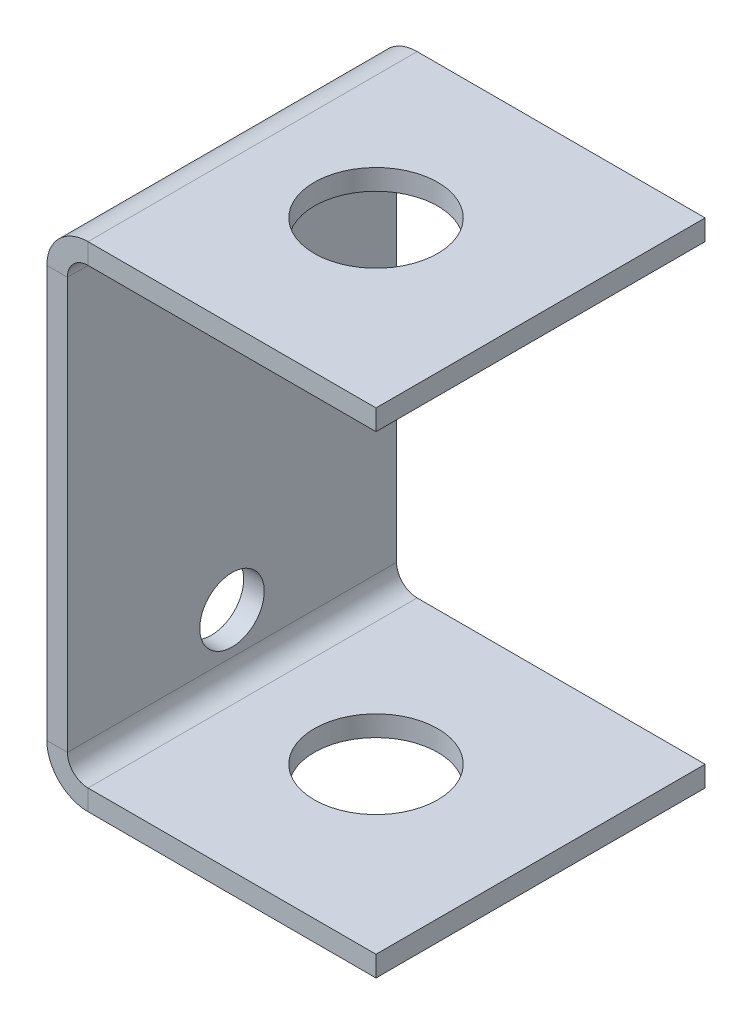
ISO-10303-21;
HEADER;
FILE_DESCRIPTION(('STEP AP214'),'2;1');
FILE_NAME('part.step','',(''),(''),'','','');
FILE_SCHEMA(('AUTOMOTIVE_DESIGN { 1 0 10303 214 1 1 1 1 }'));
ENDSEC;
DATA;
#1=APPLICATION_CONTEXT('core data for automotive mechanical design processes');
#2=APPLICATION_PROTOCOL_DEFINITION('international standard','automotive_design',2000,#1);
#3=PRODUCT_CONTEXT('',#1,'mechanical');
#4=PRODUCT('Part','Part','',(#3));
#5=PRODUCT_RELATED_PRODUCT_CATEGORY('part','',(#4));
#6=PRODUCT_DEFINITION_FORMATION('','',#4);
#7=PRODUCT_DEFINITION_CONTEXT('part definition',#1,'design');
#8=PRODUCT_DEFINITION('design','',#6,#7);
#9=PRODUCT_DEFINITION_SHAPE('','',#8);
#10=(LENGTH_UNIT() NAMED_UNIT(*) SI_UNIT(.MILLI.,.METRE.));
#11=(NAMED_UNIT(*) PLANE_ANGLE_UNIT() SI_UNIT($,.RADIAN.));
#12=(NAMED_UNIT(*) SI_UNIT($,.STERADIAN.) SOLID_ANGLE_UNIT());
#13=UNCERTAINTY_MEASURE_WITH_UNIT(LENGTH_MEASURE(1.E-05),#10,'distance_accuracy_value','');
#14=(GEOMETRIC_REPRESENTATION_CONTEXT(3) GLOBAL_UNCERTAINTY_ASSIGNED_CONTEXT((#13)) GLOBAL_UNIT_ASSIGNED_CONTEXT((#10,
#11,#12)) REPRESENTATION_CONTEXT('',''));
#15=CARTESIAN_POINT('',(0.,0.,0.));
#16=DIRECTION('',(0.,0.,1.));
#17=DIRECTION('',(1.,0.,0.));
#18=AXIS2_PLACEMENT_3D('',#15,#16,#17);
#19=CARTESIAN_POINT('',(15.875,627.3430863957,0.));
#20=DIRECTION('',(0.,0.,-1.));
#21=DIRECTION('',(-1.,0.,0.));
#22=AXIS2_PLACEMENT_3D('',#19,#20,#21);
#23=PLANE('',#22);
#24=DIRECTION('',(-1.,0.,0.));
#25=VECTOR('',#24,1.);
#26=CARTESIAN_POINT('',(12.7,627.3430863957,0.));
#27=LINE('',#26,#25);
#28=CARTESIAN_POINT('',(14.2875,627.3430863957,0.));
#29=VERTEX_POINT('',#28);
#30=CARTESIAN_POINT('',(12.7,627.3430863957,0.));
#31=VERTEX_POINT('',#30);
#32=EDGE_CURVE('E11',#29,#31,#27,.T.);
#33=ORIENTED_EDGE('',*,*,#32,.F.);
#34=CARTESIAN_POINT('',(15.875,627.3430863957,0.));
#35=DIRECTION('',(0.,0.,1.));
#36=DIRECTION('',(1.,0.,0.));
#37=AXIS2_PLACEMENT_3D('',#34,#35,#36);
#38=CIRCLE('',#37,1.58749999999997);
#39=CARTESIAN_POINT('',(15.875,628.9305863957,0.));
#40=VERTEX_POINT('',#39);
#41=EDGE_CURVE('E104',#40,#29,#38,.T.);
#42=ORIENTED_EDGE('',*,*,#41,.F.);
#43=DIRECTION('',(0.,1.,0.));
#44=VECTOR('',#43,1.);
#45=CARTESIAN_POINT('',(15.875,630.5180863957,0.));
#46=LINE('',#45,#44);
#47=CARTESIAN_POINT('',(15.875,630.5180863957,0.));
#48=VERTEX_POINT('',#47);
#49=EDGE_CURVE('E51',#40,#48,#46,.T.);
#50=ORIENTED_EDGE('',*,*,#49,.T.);
#51=CARTESIAN_POINT('',(15.875,627.3430863957,0.));
#52=DIRECTION('',(0.,0.,1.));
#53=DIRECTION('',(1.,0.,0.));
#54=AXIS2_PLACEMENT_3D('',#51,#52,#53);
#55=CIRCLE('',#54,3.17499999999997);
#56=EDGE_CURVE('E107',#48,#31,#55,.T.);
#57=ORIENTED_EDGE('',*,*,#56,.T.);
#58=EDGE_LOOP('',(#33,#42,#50,#57));
#59=FACE_BOUND('',#58,.T.);
#60=ADVANCED_FACE('F41',(#59),#23,.F.);
#61=CARTESIAN_POINT('',(15.875,630.5180863957,0.));
#62=DIRECTION('',(0.,0.,-1.));
#63=DIRECTION('',(-1.,0.,0.));
#64=AXIS2_PLACEMENT_3D('',#61,#62,#63);
#65=PLANE('',#64);
#66=ORIENTED_EDGE('',*,*,#49,.F.);
#67=DIRECTION('',(1.,0.,0.));
#68=VECTOR('',#67,1.);
#69=CARTESIAN_POINT('',(15.875,628.9305863957,0.));
#70=LINE('',#69,#68);
#71=CARTESIAN_POINT('',(38.0999999999999,628.9305863957,0.));
#72=VERTEX_POINT('',#71);
#73=EDGE_CURVE('E218',#72,#40,#70,.F.);
#74=ORIENTED_EDGE('',*,*,#73,.F.);
#75=DIRECTION('',(0.,1.,0.));
#76=VECTOR('',#75,1.);
#77=CARTESIAN_POINT('',(38.0999999999999,630.5180863957,0.));
#78=LINE('',#77,#76);
#79=CARTESIAN_POINT('',(38.0999999999999,630.5180863957,0.));
#80=VERTEX_POINT('',#79);
#81=EDGE_CURVE('E171',#72,#80,#78,.T.);
#82=ORIENTED_EDGE('',*,*,#81,.T.);
#83=DIRECTION('',(-1.,0.,0.));
#84=VECTOR('',#83,1.);
#85=CARTESIAN_POINT('',(15.875,630.5180863957,0.));
#86=LINE('',#85,#84);
#87=EDGE_CURVE('E211',#80,#48,#86,.T.);
#88=ORIENTED_EDGE('',*,*,#87,.T.);
#89=EDGE_LOOP('',(#66,#74,#82,#88));
#90=FACE_BOUND('',#89,.T.);
#91=ADVANCED_FACE('F329',(#90),#65,.F.);
#92=CARTESIAN_POINT('',(38.0999999999999,630.5180863957,-25.4));
#93=DIRECTION('',(-1.,0.,0.));
#94=DIRECTION('',(0.,0.,1.));
#95=AXIS2_PLACEMENT_3D('',#92,#93,#94);
#96=PLANE('',#95);
#97=ORIENTED_EDGE('',*,*,#81,.F.);
#98=DIRECTION('',(0.,0.,1.));
#99=VECTOR('',#98,1.);
#100=CARTESIAN_POINT('',(38.0999999999999,628.9305863957,-25.4));
#101=LINE('',#100,#99);
#102=CARTESIAN_POINT('',(38.0999999999999,628.9305863957,-25.4));
#103=VERTEX_POINT('',#102);
#104=EDGE_CURVE('E216',#103,#72,#101,.T.);
#105=ORIENTED_EDGE('',*,*,#104,.F.);
#106=DIRECTION('',(0.,1.,0.));
#107=VECTOR('',#106,1.);
#108=CARTESIAN_POINT('',(38.0999999999999,630.5180863957,-25.4));
#109=LINE('',#108,#107);
#110=CARTESIAN_POINT('',(38.0999999999999,630.5180863957,-25.4));
#111=VERTEX_POINT('',#110);
#112=EDGE_CURVE('E168',#103,#111,#109,.T.);
#113=ORIENTED_EDGE('',*,*,#112,.T.);
#114=DIRECTION('',(0.,0.,1.));
#115=VECTOR('',#114,1.);
#116=CARTESIAN_POINT('',(38.0999999999999,630.5180863957,-25.4));
#117=LINE('',#116,#115);
#118=EDGE_CURVE('E234',#111,#80,#117,.T.);
#119=ORIENTED_EDGE('',*,*,#118,.T.);
#120=EDGE_LOOP('',(#97,#105,#113,#119));
#121=FACE_BOUND('',#120,.T.);
#122=ADVANCED_FACE('F335',(#121),#96,.F.);
#123=CARTESIAN_POINT('',(15.875,630.5180863957,-25.4));
#124=DIRECTION('',(0.,0.,-1.));
#125=DIRECTION('',(-1.,0.,0.));
#126=AXIS2_PLACEMENT_3D('',#123,#124,#125);
#127=PLANE('',#126);
#128=ORIENTED_EDGE('',*,*,#112,.F.);
#129=DIRECTION('',(1.,0.,0.));
#130=VECTOR('',#129,1.);
#131=CARTESIAN_POINT('',(15.875,628.9305863957,-25.4));
#132=LINE('',#131,#130);
#133=CARTESIAN_POINT('',(15.875,628.9305863957,-25.4));
#134=VERTEX_POINT('',#133);
#135=EDGE_CURVE('E198',#103,#134,#132,.F.);
#136=ORIENTED_EDGE('',*,*,#135,.T.);
#137=DIRECTION('',(0.,1.,0.));
#138=VECTOR('',#137,1.);
#139=CARTESIAN_POINT('',(15.875,630.5180863957,-25.4));
#140=LINE('',#139,#138);
#141=CARTESIAN_POINT('',(15.875,630.5180863957,-25.4));
#142=VERTEX_POINT('',#141);
#143=EDGE_CURVE('E165',#134,#142,#140,.T.);
#144=ORIENTED_EDGE('',*,*,#143,.T.);
#145=DIRECTION('',(-1.,0.,0.));
#146=VECTOR('',#145,1.);
#147=CARTESIAN_POINT('',(15.875,630.5180863957,-25.4));
#148=LINE('',#147,#146);
#149=EDGE_CURVE('E237',#111,#142,#148,.T.);
#150=ORIENTED_EDGE('',*,*,#149,.F.);
#151=EDGE_LOOP('',(#128,#136,#144,#150));
#152=FACE_BOUND('',#151,.T.);
#153=ADVANCED_FACE('F506',(#152),#127,.T.);
#154=CARTESIAN_POINT('',(15.875,627.3430863957,-25.4));
#155=DIRECTION('',(0.,0.,-1.));
#156=DIRECTION('',(-1.,0.,0.));
#157=AXIS2_PLACEMENT_3D('',#154,#155,#156);
#158=PLANE('',#157);
#159=ORIENTED_EDGE('',*,*,#143,.F.);
#160=CARTESIAN_POINT('',(15.875,627.3430863957,-25.4));
#161=DIRECTION('',(0.,0.,1.));
#162=DIRECTION('',(1.,0.,0.));
#163=AXIS2_PLACEMENT_3D('',#160,#161,#162);
#164=CIRCLE('',#163,1.58749999999997);
#165=CARTESIAN_POINT('',(14.2875,627.3430863957,-25.4));
#166=VERTEX_POINT('',#165);
#167=EDGE_CURVE('E133',#134,#166,#164,.T.);
#168=ORIENTED_EDGE('',*,*,#167,.T.);
#169=DIRECTION('',(-1.,0.,0.));
#170=VECTOR('',#169,1.);
#171=CARTESIAN_POINT('',(12.7,627.3430863957,-25.4));
#172=LINE('',#171,#170);
#173=CARTESIAN_POINT('',(12.7,627.3430863957,-25.4));
#174=VERTEX_POINT('',#173);
#175=EDGE_CURVE('E162',#166,#174,#172,.T.);
#176=ORIENTED_EDGE('',*,*,#175,.T.);
#177=CARTESIAN_POINT('',(15.875,627.3430863957,-25.4));
#178=DIRECTION('',(0.,0.,1.));
#179=DIRECTION('',(1.,0.,0.));
#180=AXIS2_PLACEMENT_3D('',#177,#178,#179);
#181=CIRCLE('',#180,3.17499999999997);
#182=EDGE_CURVE('E260',#142,#174,#181,.T.);
#183=ORIENTED_EDGE('',*,*,#182,.F.);
#184=EDGE_LOOP('',(#159,#168,#176,#183));
#185=FACE_BOUND('',#184,.T.);
#186=ADVANCED_FACE('F296',(#185),#158,.T.);
#187=CARTESIAN_POINT('',(12.7,595.5930863957,-25.4));
#188=DIRECTION('',(0.,0.,-1.));
#189=DIRECTION('',(0.,-1.,0.));
#190=AXIS2_PLACEMENT_3D('',#187,#188,#189);
#191=PLANE('',#190);
#192=ORIENTED_EDGE('',*,*,#175,.F.);
#193=DIRECTION('',(0.,-1.,0.));
#194=VECTOR('',#193,1.);
#195=CARTESIAN_POINT('',(14.2875,595.5930863957,-25.4));
#196=LINE('',#195,#194);
#197=CARTESIAN_POINT('',(14.2875,595.5930863957,-25.4));
#198=VERTEX_POINT('',#197);
#199=EDGE_CURVE('E123',#166,#198,#196,.T.);
#200=ORIENTED_EDGE('',*,*,#199,.T.);
#201=DIRECTION('',(-1.,0.,0.));
#202=VECTOR('',#201,1.);
#203=CARTESIAN_POINT('',(12.7,595.5930863957,-25.4));
#204=LINE('',#203,#202);
#205=CARTESIAN_POINT('',(12.7,595.5930863957,-25.4));
#206=VERTEX_POINT('',#205);
#207=EDGE_CURVE('E159',#198,#206,#204,.T.);
#208=ORIENTED_EDGE('',*,*,#207,.T.);
#209=DIRECTION('',(0.,-1.,0.));
#210=VECTOR('',#209,1.);
#211=CARTESIAN_POINT('',(12.7,595.5930863957,-25.4));
#212=LINE('',#211,#210);
#213=EDGE_CURVE('E253',#174,#206,#212,.T.);
#214=ORIENTED_EDGE('',*,*,#213,.F.);
#215=EDGE_LOOP('',(#192,#200,#208,#214));
#216=FACE_BOUND('',#215,.T.);
#217=ADVANCED_FACE('F289',(#216),#191,.T.);
#218=CARTESIAN_POINT('',(15.875,595.5930863957,-25.4));
#219=DIRECTION('',(0.,0.,-1.));
#220=DIRECTION('',(-1.,0.,0.));
#221=AXIS2_PLACEMENT_3D('',#218,#219,#220);
#222=PLANE('',#221);
#223=ORIENTED_EDGE('',*,*,#207,.F.);
#224=CARTESIAN_POINT('',(15.875,595.5930863957,-25.4));
#225=DIRECTION('',(0.,0.,1.));
#226=DIRECTION('',(1.,0.,0.));
#227=AXIS2_PLACEMENT_3D('',#224,#225,#226);
#228=CIRCLE('',#227,1.58750000000003);
#229=CARTESIAN_POINT('',(15.875,594.0055863957,-25.4));
#230=VERTEX_POINT('',#229);
#231=EDGE_CURVE('E202',#198,#230,#228,.T.);
#232=ORIENTED_EDGE('',*,*,#231,.T.);
#233=DIRECTION('',(0.,-1.,0.));
#234=VECTOR('',#233,1.);
#235=CARTESIAN_POINT('',(15.875,592.4180863957,-25.4));
#236=LINE('',#235,#234);
#237=CARTESIAN_POINT('',(15.875,592.4180863957,-25.4));
#238=VERTEX_POINT('',#237);
#239=EDGE_CURVE('E156',#230,#238,#236,.T.);
#240=ORIENTED_EDGE('',*,*,#239,.T.);
#241=CARTESIAN_POINT('',(15.875,595.5930863957,-25.4));
#242=DIRECTION('',(0.,0.,1.));
#243=DIRECTION('',(1.,0.,0.));
#244=AXIS2_PLACEMENT_3D('',#241,#242,#243);
#245=CIRCLE('',#244,3.17500000000003);
#246=EDGE_CURVE('E174',#206,#238,#245,.T.);
#247=ORIENTED_EDGE('',*,*,#246,.F.);
#248=EDGE_LOOP('',(#223,#232,#240,#247));
#249=FACE_BOUND('',#248,.T.);
#250=ADVANCED_FACE('F316',(#249),#222,.T.);
#251=CARTESIAN_POINT('',(38.0999999999999,592.4180863957,-25.4));
#252=DIRECTION('',(0.,0.,-1.));
#253=DIRECTION('',(1.,0.,0.));
#254=AXIS2_PLACEMENT_3D('',#251,#252,#253);
#255=PLANE('',#254);
#256=ORIENTED_EDGE('',*,*,#239,.F.);
#257=DIRECTION('',(1.,0.,0.));
#258=VECTOR('',#257,1.);
#259=CARTESIAN_POINT('',(38.0999999999999,594.0055863957,-25.4));
#260=LINE('',#259,#258);
#261=CARTESIAN_POINT('',(38.0999999999999,594.0055863957,-25.4));
#262=VERTEX_POINT('',#261);
#263=EDGE_CURVE('E194',#230,#262,#260,.T.);
#264=ORIENTED_EDGE('',*,*,#263,.T.);
#265=DIRECTION('',(0.,-1.,0.));
#266=VECTOR('',#265,1.);
#267=CARTESIAN_POINT('',(38.0999999999999,592.4180863957,-25.4));
#268=LINE('',#267,#266);
#269=CARTESIAN_POINT('',(38.0999999999999,592.4180863957,-25.4));
#270=VERTEX_POINT('',#269);
#271=EDGE_CURVE('E154',#262,#270,#268,.T.);
#272=ORIENTED_EDGE('',*,*,#271,.T.);
#273=DIRECTION('',(1.,0.,0.));
#274=VECTOR('',#273,1.);
#275=CARTESIAN_POINT('',(38.0999999999999,592.4180863957,-25.4));
#276=LINE('',#275,#274);
#277=EDGE_CURVE('E268',#238,#270,#276,.T.);
#278=ORIENTED_EDGE('',*,*,#277,.F.);
#279=EDGE_LOOP('',(#256,#264,#272,#278));
#280=FACE_BOUND('',#279,.T.);
#281=ADVANCED_FACE('F318',(#280),#255,.T.);
#282=CARTESIAN_POINT('',(38.0999999999999,592.4180863957,-25.4));
#283=DIRECTION('',(1.,0.,0.));
#284=DIRECTION('',(0.,0.,1.));
#285=AXIS2_PLACEMENT_3D('',#282,#283,#284);
#286=PLANE('',#285);
#287=ORIENTED_EDGE('',*,*,#271,.F.);
#288=DIRECTION('',(0.,0.,-1.));
#289=VECTOR('',#288,1.);
#290=CARTESIAN_POINT('',(38.0999999999999,594.0055863957,-25.4));
#291=LINE('',#290,#289);
#292=CARTESIAN_POINT('',(38.0999999999999,594.0055863957,0.));
#293=VERTEX_POINT('',#292);
#294=EDGE_CURVE('E203',#262,#293,#291,.F.);
#295=ORIENTED_EDGE('',*,*,#294,.T.);
#296=DIRECTION('',(0.,-1.,0.));
#297=VECTOR('',#296,1.);
#298=CARTESIAN_POINT('',(38.0999999999999,592.4180863957,0.));
#299=LINE('',#298,#297);
#300=CARTESIAN_POINT('',(38.0999999999999,592.4180863957,0.));
#301=VERTEX_POINT('',#300);
#302=EDGE_CURVE('E60',#293,#301,#299,.T.);
#303=ORIENTED_EDGE('',*,*,#302,.T.);
#304=DIRECTION('',(0.,0.,1.));
#305=VECTOR('',#304,1.);
#306=CARTESIAN_POINT('',(38.0999999999999,592.4180863957,-25.4));
#307=LINE('',#306,#305);
#308=EDGE_CURVE('E187',#270,#301,#307,.T.);
#309=ORIENTED_EDGE('',*,*,#308,.F.);
#310=EDGE_LOOP('',(#287,#295,#303,#309));
#311=FACE_BOUND('',#310,.T.);
#312=ADVANCED_FACE('F319',(#311),#286,.T.);
#313=CARTESIAN_POINT('',(38.0999999999999,592.4180863957,0.));
#314=DIRECTION('',(0.,0.,-1.));
#315=DIRECTION('',(1.,0.,0.));
#316=AXIS2_PLACEMENT_3D('',#313,#314,#315);
#317=PLANE('',#316);
#318=ORIENTED_EDGE('',*,*,#302,.F.);
#319=DIRECTION('',(1.,0.,0.));
#320=VECTOR('',#319,1.);
#321=CARTESIAN_POINT('',(38.0999999999999,594.0055863957,0.));
#322=LINE('',#321,#320);
#323=CARTESIAN_POINT('',(15.875,594.0055863957,0.));
#324=VERTEX_POINT('',#323);
#325=EDGE_CURVE('E195',#324,#293,#322,.T.);
#326=ORIENTED_EDGE('',*,*,#325,.F.);
#327=DIRECTION('',(0.,-1.,0.));
#328=VECTOR('',#327,1.);
#329=CARTESIAN_POINT('',(15.875,592.4180863957,0.));
#330=LINE('',#329,#328);
#331=CARTESIAN_POINT('',(15.875,592.4180863957,0.));
#332=VERTEX_POINT('',#331);
#333=EDGE_CURVE('E150',#324,#332,#330,.T.);
#334=ORIENTED_EDGE('',*,*,#333,.T.);
#335=DIRECTION('',(1.,0.,0.));
#336=VECTOR('',#335,1.);
#337=CARTESIAN_POINT('',(38.0999999999999,592.4180863957,0.));
#338=LINE('',#337,#336);
#339=EDGE_CURVE('E263',#332,#301,#338,.T.);
#340=ORIENTED_EDGE('',*,*,#339,.T.);
#341=EDGE_LOOP('',(#318,#326,#334,#340));
#342=FACE_BOUND('',#341,.T.);
#343=ADVANCED_FACE('F276',(#342),#317,.F.);
#344=CARTESIAN_POINT('',(15.875,595.5930863957,0.));
#345=DIRECTION('',(0.,0.,-1.));
#346=DIRECTION('',(-1.,0.,0.));
#347=AXIS2_PLACEMENT_3D('',#344,#345,#346);
#348=PLANE('',#347);
#349=ORIENTED_EDGE('',*,*,#333,.F.);
#350=CARTESIAN_POINT('',(15.875,595.5930863957,0.));
#351=DIRECTION('',(0.,0.,1.));
#352=DIRECTION('',(1.,0.,0.));
#353=AXIS2_PLACEMENT_3D('',#350,#351,#352);
#354=CIRCLE('',#353,1.58750000000003);
#355=CARTESIAN_POINT('',(14.2875,595.5930863957,0.));
#356=VERTEX_POINT('',#355);
#357=EDGE_CURVE('E199',#356,#324,#354,.T.);
#358=ORIENTED_EDGE('',*,*,#357,.F.);
#359=DIRECTION('',(-1.,0.,0.));
#360=VECTOR('',#359,1.);
#361=CARTESIAN_POINT('',(12.7,595.5930863957,0.));
#362=LINE('',#361,#360);
#363=CARTESIAN_POINT('',(12.7,595.5930863957,0.));
#364=VERTEX_POINT('',#363);
#365=EDGE_CURVE('E139',#356,#364,#362,.T.);
#366=ORIENTED_EDGE('',*,*,#365,.T.);
#367=CARTESIAN_POINT('',(15.875,595.5930863957,0.));
#368=DIRECTION('',(0.,0.,1.));
#369=DIRECTION('',(1.,0.,0.));
#370=AXIS2_PLACEMENT_3D('',#367,#368,#369);
#371=CIRCLE('',#370,3.17500000000003);
#372=EDGE_CURVE('E180',#364,#332,#371,.T.);
#373=ORIENTED_EDGE('',*,*,#372,.T.);
#374=EDGE_LOOP('',(#349,#358,#366,#373));
#375=FACE_BOUND('',#374,.T.);
#376=ADVANCED_FACE('F279',(#375),#348,.F.);
#377=CARTESIAN_POINT('',(12.6999999999996,624.1680863957,-12.7));
#378=DIRECTION('',(-1.,0.,0.));
#379=DIRECTION('',(0.,-1.,0.));
#380=AXIS2_PLACEMENT_3D('',#377,#378,#379);
#381=CYLINDRICAL_SURFACE('',#380,2.48919999999993);
#382=CARTESIAN_POINT('',(12.6999999999996,624.1680863957,-12.7));
#383=DIRECTION('',(-1.,0.,0.));
#384=DIRECTION('',(0.,-1.,0.));
#385=AXIS2_PLACEMENT_3D('',#382,#383,#384);
#386=CIRCLE('',#385,2.48919999999993);
#387=CARTESIAN_POINT('',(12.6999999999996,621.6788863957,-12.7));
#388=VERTEX_POINT('',#387);
#389=EDGE_CURVE('E243',#388,#388,#386,.T.);
#390=ORIENTED_EDGE('',*,*,#389,.T.);
#391=EDGE_LOOP('',(#390));
#392=FACE_BOUND('',#391,.T.);
#393=CARTESIAN_POINT('',(14.2874999999996,624.1680863957,-12.7));
#394=DIRECTION('',(-1.,0.,0.));
#395=DIRECTION('',(0.,-1.,0.));
#396=AXIS2_PLACEMENT_3D('',#393,#394,#395);
#397=CIRCLE('',#396,2.48919999999993);
#398=CARTESIAN_POINT('',(14.2874999999996,621.6788863957,-12.7));
#399=VERTEX_POINT('',#398);
#400=EDGE_CURVE('E144',#399,#399,#397,.T.);
#401=ORIENTED_EDGE('',*,*,#400,.F.);
#402=EDGE_LOOP('',(#401));
#403=FACE_BOUND('',#402,.T.);
#404=ADVANCED_FACE('F342',(#392,#403),#381,.F.);
#405=CARTESIAN_POINT('',(12.6999999999996,598.7680863957,-12.7));
#406=DIRECTION('',(-1.,0.,0.));
#407=DIRECTION('',(0.,-1.,0.));
#408=AXIS2_PLACEMENT_3D('',#405,#406,#407);
#409=CYLINDRICAL_SURFACE('',#408,2.48919999999993);
#410=CARTESIAN_POINT('',(12.6999999999996,598.7680863957,-12.7));
#411=DIRECTION('',(-1.,0.,0.));
#412=DIRECTION('',(0.,-1.,0.));
#413=AXIS2_PLACEMENT_3D('',#410,#411,#412);
#414=CIRCLE('',#413,2.48919999999993);
#415=CARTESIAN_POINT('',(12.6999999999996,596.2788863957,-12.7));
#416=VERTEX_POINT('',#415);
#417=EDGE_CURVE('E246',#416,#416,#414,.T.);
#418=ORIENTED_EDGE('',*,*,#417,.T.);
#419=EDGE_LOOP('',(#418));
#420=FACE_BOUND('',#419,.T.);
#421=CARTESIAN_POINT('',(14.2874999999996,598.7680863957,-12.7));
#422=DIRECTION('',(-1.,0.,0.));
#423=DIRECTION('',(0.,-1.,0.));
#424=AXIS2_PLACEMENT_3D('',#421,#422,#423);
#425=CIRCLE('',#424,2.48919999999993);
#426=CARTESIAN_POINT('',(14.2874999999996,596.2788863957,-12.7));
#427=VERTEX_POINT('',#426);
#428=EDGE_CURVE('E141',#427,#427,#425,.T.);
#429=ORIENTED_EDGE('',*,*,#428,.F.);
#430=EDGE_LOOP('',(#429));
#431=FACE_BOUND('',#430,.T.);
#432=ADVANCED_FACE('F43',(#420,#431),#409,.F.);
#433=CARTESIAN_POINT('',(12.7,595.5930863957,0.));
#434=DIRECTION('',(0.,0.,-1.));
#435=DIRECTION('',(0.,-1.,0.));
#436=AXIS2_PLACEMENT_3D('',#433,#434,#435);
#437=PLANE('',#436);
#438=DIRECTION('',(0.,-1.,0.));
#439=VECTOR('',#438,1.);
#440=CARTESIAN_POINT('',(14.2875,595.5930863957,0.));
#441=LINE('',#440,#439);
#442=EDGE_CURVE('E120',#29,#356,#441,.T.);
#443=ORIENTED_EDGE('',*,*,#442,.F.);
#444=ORIENTED_EDGE('',*,*,#32,.T.);
#445=DIRECTION('',(0.,-1.,0.));
#446=VECTOR('',#445,1.);
#447=CARTESIAN_POINT('',(12.7,595.5930863957,0.));
#448=LINE('',#447,#446);
#449=EDGE_CURVE('E249',#31,#364,#448,.T.);
#450=ORIENTED_EDGE('',*,*,#449,.T.);
#451=ORIENTED_EDGE('',*,*,#365,.F.);
#452=EDGE_LOOP('',(#443,#444,#450,#451));
#453=FACE_BOUND('',#452,.T.);
#454=ADVANCED_FACE('F137',(#453),#437,.F.);
#455=CARTESIAN_POINT('',(15.875,595.5930863957,-25.4));
#456=DIRECTION('',(0.,0.,1.));
#457=DIRECTION('',(1.,0.,0.));
#458=AXIS2_PLACEMENT_3D('',#455,#456,#457);
#459=CYLINDRICAL_SURFACE('',#458,3.17500000000003);
#460=ORIENTED_EDGE('',*,*,#372,.F.);
#461=DIRECTION('',(0.,0.,1.));
#462=VECTOR('',#461,1.);
#463=CARTESIAN_POINT('',(12.7,595.5930863957,-25.4));
#464=LINE('',#463,#462);
#465=EDGE_CURVE('E256',#206,#364,#464,.T.);
#466=ORIENTED_EDGE('',*,*,#465,.F.);
#467=ORIENTED_EDGE('',*,*,#246,.T.);
#468=DIRECTION('',(0.,0.,1.));
#469=VECTOR('',#468,1.);
#470=CARTESIAN_POINT('',(15.875,592.4180863957,-25.4));
#471=LINE('',#470,#469);
#472=EDGE_CURVE('E266',#238,#332,#471,.T.);
#473=ORIENTED_EDGE('',*,*,#472,.T.);
#474=EDGE_LOOP('',(#460,#466,#467,#473));
#475=FACE_BOUND('',#474,.T.);
#476=ADVANCED_FACE('F341',(#475),#459,.T.);
#477=CARTESIAN_POINT('',(38.0999999999999,592.4180863957,-25.4));
#478=DIRECTION('',(0.,-1.,0.));
#479=DIRECTION('',(0.,0.,-1.));
#480=AXIS2_PLACEMENT_3D('',#477,#478,#479);
#481=PLANE('',#480);
#482=CARTESIAN_POINT('',(25.3999999999999,592.4180863957,-12.7));
#483=DIRECTION('',(0.,1.,0.));
#484=DIRECTION('',(0.,0.,1.));
#485=AXIS2_PLACEMENT_3D('',#482,#483,#484);
#486=CIRCLE('',#485,4.7625);
#487=CARTESIAN_POINT('',(25.3999999999999,592.4180863957,-7.9375));
#488=VERTEX_POINT('',#487);
#489=EDGE_CURVE('E227',#488,#488,#486,.T.);
#490=ORIENTED_EDGE('',*,*,#489,.T.);
#491=EDGE_LOOP('',(#490));
#492=FACE_BOUND('',#491,.T.);
#493=ORIENTED_EDGE('',*,*,#339,.F.);
#494=ORIENTED_EDGE('',*,*,#472,.F.);
#495=ORIENTED_EDGE('',*,*,#277,.T.);
#496=ORIENTED_EDGE('',*,*,#308,.T.);
#497=EDGE_LOOP('',(#493,#494,#495,#496));
#498=FACE_BOUND('',#497,.T.);
#499=ADVANCED_FACE('F272',(#492,#498),#481,.T.);
#500=CARTESIAN_POINT('',(15.875,627.3430863957,-25.4));
#501=DIRECTION('',(0.,0.,1.));
#502=DIRECTION('',(1.,0.,0.));
#503=AXIS2_PLACEMENT_3D('',#500,#501,#502);
#504=CYLINDRICAL_SURFACE('',#503,3.17499999999997);
#505=ORIENTED_EDGE('',*,*,#56,.F.);
#506=DIRECTION('',(0.,0.,1.));
#507=VECTOR('',#506,1.);
#508=CARTESIAN_POINT('',(15.875,630.5180863957,-25.4));
#509=LINE('',#508,#507);
#510=EDGE_CURVE('E240',#142,#48,#509,.T.);
#511=ORIENTED_EDGE('',*,*,#510,.F.);
#512=ORIENTED_EDGE('',*,*,#182,.T.);
#513=DIRECTION('',(0.,0.,1.));
#514=VECTOR('',#513,1.);
#515=CARTESIAN_POINT('',(12.7,627.3430863957,-25.4));
#516=LINE('',#515,#514);
#517=EDGE_CURVE('E251',#174,#31,#516,.T.);
#518=ORIENTED_EDGE('',*,*,#517,.T.);
#519=EDGE_LOOP('',(#505,#511,#512,#518));
#520=FACE_BOUND('',#519,.T.);
#521=ADVANCED_FACE('F301',(#520),#504,.T.);
#522=CARTESIAN_POINT('',(12.7,595.5930863957,-25.4));
#523=DIRECTION('',(-1.,0.,0.));
#524=DIRECTION('',(0.,-1.,0.));
#525=AXIS2_PLACEMENT_3D('',#522,#523,#524);
#526=PLANE('',#525);
#527=ORIENTED_EDGE('',*,*,#389,.F.);
#528=EDGE_LOOP('',(#527));
#529=FACE_BOUND('',#528,.T.);
#530=ORIENTED_EDGE('',*,*,#417,.F.);
#531=EDGE_LOOP('',(#530));
#532=FACE_BOUND('',#531,.T.);
#533=ORIENTED_EDGE('',*,*,#449,.F.);
#534=ORIENTED_EDGE('',*,*,#517,.F.);
#535=ORIENTED_EDGE('',*,*,#213,.T.);
#536=ORIENTED_EDGE('',*,*,#465,.T.);
#537=EDGE_LOOP('',(#533,#534,#535,#536));
#538=FACE_BOUND('',#537,.T.);
#539=ADVANCED_FACE('F381',(#529,#532,#538),#526,.T.);
#540=CARTESIAN_POINT('',(15.875,630.5180863957,-25.4));
#541=DIRECTION('',(0.,1.,0.));
#542=DIRECTION('',(0.,0.,1.));
#543=AXIS2_PLACEMENT_3D('',#540,#541,#542);
#544=PLANE('',#543);
#545=CARTESIAN_POINT('',(25.3999999999999,630.5180863957,-12.7));
#546=DIRECTION('',(0.,1.,0.));
#547=DIRECTION('',(0.,0.,1.));
#548=AXIS2_PLACEMENT_3D('',#545,#546,#547);
#549=CIRCLE('',#548,4.7625);
#550=CARTESIAN_POINT('',(25.3999999999999,630.5180863957,-7.9375));
#551=VERTEX_POINT('',#550);
#552=EDGE_CURVE('E230',#551,#551,#549,.T.);
#553=ORIENTED_EDGE('',*,*,#552,.F.);
#554=EDGE_LOOP('',(#553));
#555=FACE_BOUND('',#554,.T.);
#556=ORIENTED_EDGE('',*,*,#87,.F.);
#557=ORIENTED_EDGE('',*,*,#118,.F.);
#558=ORIENTED_EDGE('',*,*,#149,.T.);
#559=ORIENTED_EDGE('',*,*,#510,.T.);
#560=EDGE_LOOP('',(#556,#557,#558,#559));
#561=FACE_BOUND('',#560,.T.);
#562=ADVANCED_FACE('F307',(#555,#561),#544,.T.);
#563=CARTESIAN_POINT('',(15.875,595.5930863957,-25.4));
#564=DIRECTION('',(0.,0.,1.));
#565=DIRECTION('',(1.,0.,0.));
#566=AXIS2_PLACEMENT_3D('',#563,#564,#565);
#567=CYLINDRICAL_SURFACE('',#566,1.58750000000003);
#568=ORIENTED_EDGE('',*,*,#357,.T.);
#569=DIRECTION('',(0.,0.,1.));
#570=VECTOR('',#569,1.);
#571=CARTESIAN_POINT('',(15.875,594.0055863957,-25.4));
#572=LINE('',#571,#570);
#573=EDGE_CURVE('E192',#230,#324,#572,.T.);
#574=ORIENTED_EDGE('',*,*,#573,.F.);
#575=ORIENTED_EDGE('',*,*,#231,.F.);
#576=DIRECTION('',(0.,0.,1.));
#577=VECTOR('',#576,1.);
#578=CARTESIAN_POINT('',(14.2875,595.5930863957,-25.4));
#579=LINE('',#578,#577);
#580=EDGE_CURVE('E134',#198,#356,#579,.T.);
#581=ORIENTED_EDGE('',*,*,#580,.T.);
#582=EDGE_LOOP('',(#568,#574,#575,#581));
#583=FACE_BOUND('',#582,.T.);
#584=ADVANCED_FACE('F287',(#583),#567,.F.);
#585=CARTESIAN_POINT('',(38.0999999999999,594.0055863957,-25.4));
#586=DIRECTION('',(0.,-1.,0.));
#587=DIRECTION('',(0.,0.,-1.));
#588=AXIS2_PLACEMENT_3D('',#585,#586,#587);
#589=PLANE('',#588);
#590=CARTESIAN_POINT('',(25.3999999999999,594.0055863957,-12.7));
#591=DIRECTION('',(0.,-1.,0.));
#592=DIRECTION('',(0.,0.,-1.));
#593=AXIS2_PLACEMENT_3D('',#590,#591,#592);
#594=CIRCLE('',#593,4.7625);
#595=CARTESIAN_POINT('',(25.3999999999999,594.0055863957,-17.4625));
#596=VERTEX_POINT('',#595);
#597=EDGE_CURVE('E219',#596,#596,#594,.T.);
#598=ORIENTED_EDGE('',*,*,#597,.T.);
#599=EDGE_LOOP('',(#598));
#600=FACE_BOUND('',#599,.T.);
#601=ORIENTED_EDGE('',*,*,#325,.T.);
#602=ORIENTED_EDGE('',*,*,#294,.F.);
#603=ORIENTED_EDGE('',*,*,#263,.F.);
#604=ORIENTED_EDGE('',*,*,#573,.T.);
#605=EDGE_LOOP('',(#601,#602,#603,#604));
#606=FACE_BOUND('',#605,.T.);
#607=ADVANCED_FACE('F283',(#600,#606),#589,.F.);
#608=CARTESIAN_POINT('',(15.875,627.3430863957,-25.4));
#609=DIRECTION('',(0.,0.,1.));
#610=DIRECTION('',(1.,0.,0.));
#611=AXIS2_PLACEMENT_3D('',#608,#609,#610);
#612=CYLINDRICAL_SURFACE('',#611,1.58749999999997);
#613=ORIENTED_EDGE('',*,*,#41,.T.);
#614=DIRECTION('',(0.,0.,1.));
#615=VECTOR('',#614,1.);
#616=CARTESIAN_POINT('',(14.2875,627.3430863957,-25.4));
#617=LINE('',#616,#615);
#618=EDGE_CURVE('E117',#166,#29,#617,.T.);
#619=ORIENTED_EDGE('',*,*,#618,.F.);
#620=ORIENTED_EDGE('',*,*,#167,.F.);
#621=DIRECTION('',(0.,0.,1.));
#622=VECTOR('',#621,1.);
#623=CARTESIAN_POINT('',(15.875,628.9305863957,-25.4));
#624=LINE('',#623,#622);
#625=EDGE_CURVE('E131',#134,#40,#624,.T.);
#626=ORIENTED_EDGE('',*,*,#625,.T.);
#627=EDGE_LOOP('',(#613,#619,#620,#626));
#628=FACE_BOUND('',#627,.T.);
#629=ADVANCED_FACE('F129',(#628),#612,.F.);
#630=CARTESIAN_POINT('',(14.2875,595.5930863957,-25.4));
#631=DIRECTION('',(-1.,0.,0.));
#632=DIRECTION('',(0.,-1.,0.));
#633=AXIS2_PLACEMENT_3D('',#630,#631,#632);
#634=PLANE('',#633);
#635=ORIENTED_EDGE('',*,*,#400,.T.);
#636=EDGE_LOOP('',(#635));
#637=FACE_BOUND('',#636,.T.);
#638=ORIENTED_EDGE('',*,*,#428,.T.);
#639=EDGE_LOOP('',(#638));
#640=FACE_BOUND('',#639,.T.);
#641=ORIENTED_EDGE('',*,*,#442,.T.);
#642=ORIENTED_EDGE('',*,*,#580,.F.);
#643=ORIENTED_EDGE('',*,*,#199,.F.);
#644=ORIENTED_EDGE('',*,*,#618,.T.);
#645=EDGE_LOOP('',(#641,#642,#643,#644));
#646=FACE_BOUND('',#645,.T.);
#647=ADVANCED_FACE('F118',(#637,#640,#646),#634,.F.);
#648=CARTESIAN_POINT('',(15.875,628.9305863957,-25.4));
#649=DIRECTION('',(0.,1.,0.));
#650=DIRECTION('',(0.,0.,1.));
#651=AXIS2_PLACEMENT_3D('',#648,#649,#650);
#652=PLANE('',#651);
#653=CARTESIAN_POINT('',(25.3999999999999,628.9305863957,-12.7));
#654=DIRECTION('',(0.,1.,0.));
#655=DIRECTION('',(0.,0.,1.));
#656=AXIS2_PLACEMENT_3D('',#653,#654,#655);
#657=CIRCLE('',#656,4.7625);
#658=CARTESIAN_POINT('',(25.3999999999999,628.9305863957,-7.9375));
#659=VERTEX_POINT('',#658);
#660=EDGE_CURVE('E45',#659,#659,#657,.T.);
#661=ORIENTED_EDGE('',*,*,#660,.T.);
#662=EDGE_LOOP('',(#661));
#663=FACE_BOUND('',#662,.T.);
#664=ORIENTED_EDGE('',*,*,#73,.T.);
#665=ORIENTED_EDGE('',*,*,#625,.F.);
#666=ORIENTED_EDGE('',*,*,#135,.F.);
#667=ORIENTED_EDGE('',*,*,#104,.T.);
#668=EDGE_LOOP('',(#664,#665,#666,#667));
#669=FACE_BOUND('',#668,.T.);
#670=ADVANCED_FACE('F357',(#663,#669),#652,.F.);
#671=CARTESIAN_POINT('',(25.3999999999999,592.4180863957,-12.7));
#672=DIRECTION('',(0.,1.,0.));
#673=DIRECTION('',(0.,0.,1.));
#674=AXIS2_PLACEMENT_3D('',#671,#672,#673);
#675=CYLINDRICAL_SURFACE('',#674,4.7625);
#676=ORIENTED_EDGE('',*,*,#552,.T.);
#677=EDGE_LOOP('',(#676));
#678=FACE_BOUND('',#677,.T.);
#679=ORIENTED_EDGE('',*,*,#660,.F.);
#680=EDGE_LOOP('',(#679));
#681=FACE_BOUND('',#680,.T.);
#682=ADVANCED_FACE('F366',(#678,#681),#675,.F.);
#683=ORIENTED_EDGE('',*,*,#489,.F.);
#684=EDGE_LOOP('',(#683));
#685=FACE_BOUND('',#684,.T.);
#686=ORIENTED_EDGE('',*,*,#597,.F.);
#687=EDGE_LOOP('',(#686));
#688=FACE_BOUND('',#687,.T.);
#689=ADVANCED_FACE('F388',(#685,#688),#675,.F.);
#690=CLOSED_SHELL('',(#60,#91,#122,#153,#186,#217,#250,#281,#312,#343,#376,#404,#432,#454,#476,
#499,#521,#539,#562,#584,#607,#629,#647,#670,#682,#689));
#691=MANIFOLD_SOLID_BREP('B2',#690);
#692=ADVANCED_BREP_SHAPE_REPRESENTATION('',(#18,#691),#14);
#693=SHAPE_DEFINITION_REPRESENTATION(#9,#692);
ENDSEC;
END-ISO-10303-21;
